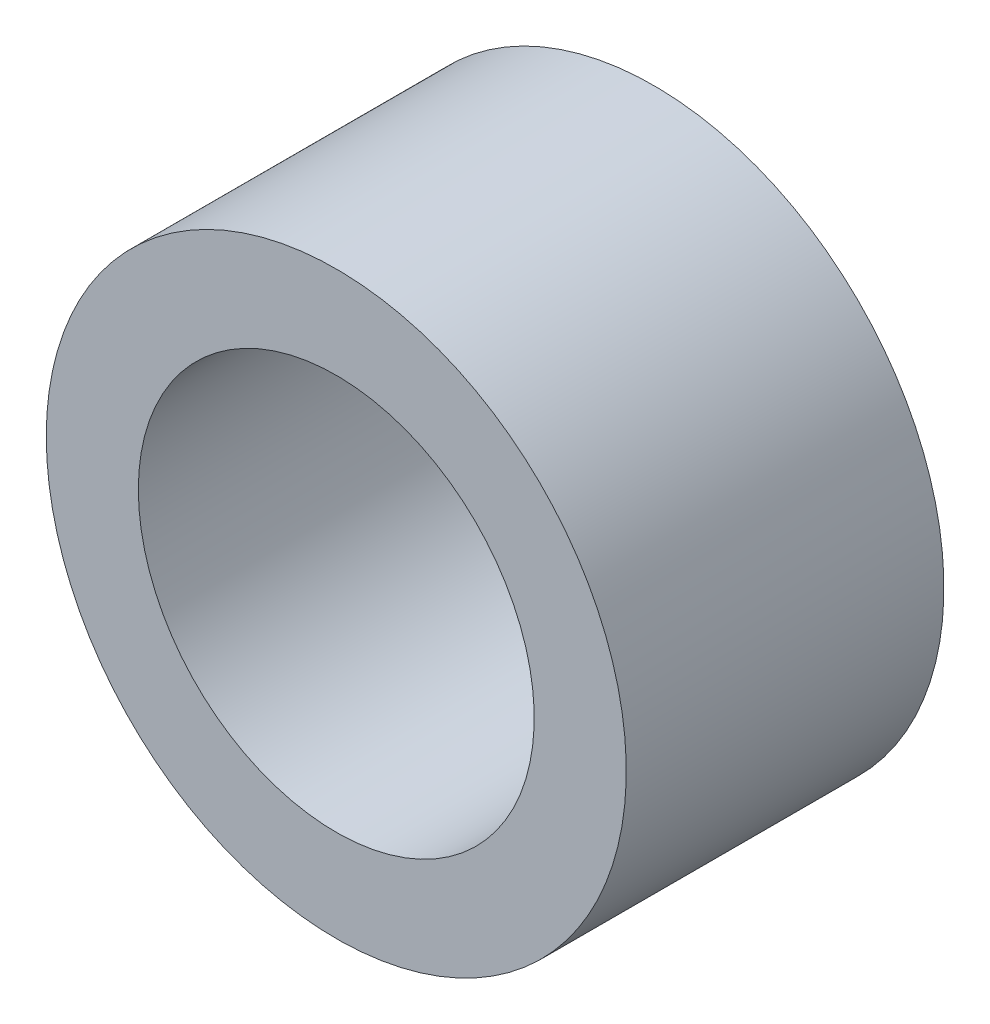
ISO-10303-21;
HEADER;
FILE_DESCRIPTION(('STEP AP214'),'2;1');
FILE_NAME('part.step','',(''),(''),'','','');
FILE_SCHEMA(('AUTOMOTIVE_DESIGN { 1 0 10303 214 1 1 1 1 }'));
ENDSEC;
DATA;
#1=APPLICATION_CONTEXT('core data for automotive mechanical design processes');
#2=APPLICATION_PROTOCOL_DEFINITION('international standard','automotive_design',2000,#1);
#3=PRODUCT_CONTEXT('',#1,'mechanical');
#4=PRODUCT('Part','Part','',(#3));
#5=PRODUCT_RELATED_PRODUCT_CATEGORY('part','',(#4));
#6=PRODUCT_DEFINITION_FORMATION('','',#4);
#7=PRODUCT_DEFINITION_CONTEXT('part definition',#1,'design');
#8=PRODUCT_DEFINITION('design','',#6,#7);
#9=PRODUCT_DEFINITION_SHAPE('','',#8);
#10=(LENGTH_UNIT() NAMED_UNIT(*) SI_UNIT(.MILLI.,.METRE.));
#11=(NAMED_UNIT(*) PLANE_ANGLE_UNIT() SI_UNIT($,.RADIAN.));
#12=(NAMED_UNIT(*) SI_UNIT($,.STERADIAN.) SOLID_ANGLE_UNIT());
#13=UNCERTAINTY_MEASURE_WITH_UNIT(LENGTH_MEASURE(1.E-05),#10,'distance_accuracy_value','');
#14=(GEOMETRIC_REPRESENTATION_CONTEXT(3) GLOBAL_UNCERTAINTY_ASSIGNED_CONTEXT((#13)) GLOBAL_UNIT_ASSIGNED_CONTEXT((#10,
#11,#12)) REPRESENTATION_CONTEXT('',''));
#15=CARTESIAN_POINT('',(0.,0.,0.));
#16=DIRECTION('',(0.,0.,1.));
#17=DIRECTION('',(1.,0.,0.));
#18=AXIS2_PLACEMENT_3D('',#15,#16,#17);
#19=CARTESIAN_POINT('',(0.,0.,3.45));
#20=DIRECTION('',(0.,0.,1.));
#21=DIRECTION('',(1.,0.,0.));
#22=AXIS2_PLACEMENT_3D('',#19,#20,#21);
#23=PLANE('',#22);
#24=CARTESIAN_POINT('',(0.,0.,3.45));
#25=DIRECTION('',(0.,0.,1.));
#26=DIRECTION('',(1.,0.,0.));
#27=AXIS2_PLACEMENT_3D('',#24,#25,#26);
#28=CIRCLE('',#27,3.15);
#29=CARTESIAN_POINT('',(-3.15,0.,3.45));
#30=VERTEX_POINT('',#29);
#31=EDGE_CURVE('E10',#30,#30,#28,.T.);
#32=ORIENTED_EDGE('',*,*,#31,.T.);
#33=EDGE_LOOP('',(#32));
#34=FACE_BOUND('',#33,.T.);
#35=CARTESIAN_POINT('',(0.,0.,3.45));
#36=DIRECTION('',(0.,0.,1.));
#37=DIRECTION('',(1.,0.,0.));
#38=AXIS2_PLACEMENT_3D('',#35,#36,#37);
#39=CIRCLE('',#38,2.15);
#40=CARTESIAN_POINT('',(-2.15,0.,3.45));
#41=VERTEX_POINT('',#40);
#42=EDGE_CURVE('E56',#41,#41,#39,.T.);
#43=ORIENTED_EDGE('',*,*,#42,.F.);
#44=EDGE_LOOP('',(#43));
#45=FACE_BOUND('',#44,.T.);
#46=ADVANCED_FACE('F43',(#34,#45),#23,.T.);
#47=CARTESIAN_POINT('',(0.,0.,0.));
#48=DIRECTION('',(0.,0.,1.));
#49=DIRECTION('',(1.,0.,0.));
#50=AXIS2_PLACEMENT_3D('',#47,#48,#49);
#51=PLANE('',#50);
#52=CARTESIAN_POINT('',(0.,0.,0.));
#53=DIRECTION('',(0.,0.,1.));
#54=DIRECTION('',(1.,0.,0.));
#55=AXIS2_PLACEMENT_3D('',#52,#53,#54);
#56=CIRCLE('',#55,3.15);
#57=CARTESIAN_POINT('',(-3.15,0.,0.));
#58=VERTEX_POINT('',#57);
#59=EDGE_CURVE('E47',#58,#58,#56,.T.);
#60=ORIENTED_EDGE('',*,*,#59,.F.);
#61=EDGE_LOOP('',(#60));
#62=FACE_BOUND('',#61,.T.);
#63=CARTESIAN_POINT('',(0.,0.,0.));
#64=DIRECTION('',(0.,0.,1.));
#65=DIRECTION('',(1.,0.,0.));
#66=AXIS2_PLACEMENT_3D('',#63,#64,#65);
#67=CIRCLE('',#66,2.15);
#68=CARTESIAN_POINT('',(-2.15,0.,0.));
#69=VERTEX_POINT('',#68);
#70=EDGE_CURVE('E58',#69,#69,#67,.T.);
#71=ORIENTED_EDGE('',*,*,#70,.T.);
#72=EDGE_LOOP('',(#71));
#73=FACE_BOUND('',#72,.T.);
#74=ADVANCED_FACE('F70',(#62,#73),#51,.F.);
#75=CARTESIAN_POINT('',(0.,0.,3.45));
#76=DIRECTION('',(0.,0.,-1.));
#77=DIRECTION('',(-1.,0.,0.));
#78=AXIS2_PLACEMENT_3D('',#75,#76,#77);
#79=CYLINDRICAL_SURFACE('',#78,3.15);
#80=CARTESIAN_POINT('',(-3.15,0.,3.45));
#81=CARTESIAN_POINT('',(-3.15,0.,3.4140625));
#82=CARTESIAN_POINT('',(-3.15,0.,3.378125));
#83=CARTESIAN_POINT('',(-3.15,0.,3.30625));
#84=CARTESIAN_POINT('',(-3.15,0.,3.2703125));
#85=CARTESIAN_POINT('',(-3.15,0.,3.1984375));
#86=CARTESIAN_POINT('',(-3.15,0.,3.1625));
#87=CARTESIAN_POINT('',(-3.15,0.,3.090625));
#88=CARTESIAN_POINT('',(-3.15,0.,3.0546875));
#89=CARTESIAN_POINT('',(-3.15,0.,2.9828125));
#90=CARTESIAN_POINT('',(-3.15,0.,2.946875));
#91=CARTESIAN_POINT('',(-3.15,0.,2.875));
#92=CARTESIAN_POINT('',(-3.15,0.,2.8390625));
#93=CARTESIAN_POINT('',(-3.15,0.,2.7671875));
#94=CARTESIAN_POINT('',(-3.15,0.,2.73125));
#95=CARTESIAN_POINT('',(-3.15,0.,2.659375));
#96=CARTESIAN_POINT('',(-3.15,0.,2.6234375));
#97=CARTESIAN_POINT('',(-3.15,0.,2.5515625));
#98=CARTESIAN_POINT('',(-3.15,0.,2.515625));
#99=CARTESIAN_POINT('',(-3.15,0.,2.44375));
#100=CARTESIAN_POINT('',(-3.15,0.,2.4078125));
#101=CARTESIAN_POINT('',(-3.15,0.,2.3359375));
#102=CARTESIAN_POINT('',(-3.15,0.,2.3));
#103=CARTESIAN_POINT('',(-3.15,0.,2.228125));
#104=CARTESIAN_POINT('',(-3.15,0.,2.1921875));
#105=CARTESIAN_POINT('',(-3.15,0.,2.1203125));
#106=CARTESIAN_POINT('',(-3.15,0.,2.084375));
#107=CARTESIAN_POINT('',(-3.15,0.,2.0125));
#108=CARTESIAN_POINT('',(-3.15,0.,1.9765625));
#109=CARTESIAN_POINT('',(-3.15,0.,1.9046875));
#110=CARTESIAN_POINT('',(-3.15,0.,1.86875));
#111=CARTESIAN_POINT('',(-3.15,0.,1.796875));
#112=CARTESIAN_POINT('',(-3.15,0.,1.7609375));
#113=CARTESIAN_POINT('',(-3.15,0.,1.6890625));
#114=CARTESIAN_POINT('',(-3.15,0.,1.653125));
#115=CARTESIAN_POINT('',(-3.15,0.,1.58125));
#116=CARTESIAN_POINT('',(-3.15,0.,1.5453125));
#117=CARTESIAN_POINT('',(-3.15,0.,1.4734375));
#118=CARTESIAN_POINT('',(-3.15,0.,1.4375));
#119=CARTESIAN_POINT('',(-3.15,0.,1.365625));
#120=CARTESIAN_POINT('',(-3.15,0.,1.3296875));
#121=CARTESIAN_POINT('',(-3.15,0.,1.2578125));
#122=CARTESIAN_POINT('',(-3.15,0.,1.221875));
#123=CARTESIAN_POINT('',(-3.15,0.,1.15));
#124=CARTESIAN_POINT('',(-3.15,0.,1.1140625));
#125=CARTESIAN_POINT('',(-3.15,0.,1.0421875));
#126=CARTESIAN_POINT('',(-3.15,0.,1.00625));
#127=CARTESIAN_POINT('',(-3.15,0.,0.934375));
#128=CARTESIAN_POINT('',(-3.15,0.,0.8984375));
#129=CARTESIAN_POINT('',(-3.15,0.,0.8265625));
#130=CARTESIAN_POINT('',(-3.15,0.,0.790625));
#131=CARTESIAN_POINT('',(-3.15,0.,0.71875));
#132=CARTESIAN_POINT('',(-3.15,0.,0.6828125));
#133=CARTESIAN_POINT('',(-3.15,0.,0.6109375));
#134=CARTESIAN_POINT('',(-3.15,0.,0.575));
#135=CARTESIAN_POINT('',(-3.15,0.,0.503125));
#136=CARTESIAN_POINT('',(-3.15,0.,0.4671875));
#137=CARTESIAN_POINT('',(-3.15,0.,0.3953125));
#138=CARTESIAN_POINT('',(-3.15,0.,0.359375));
#139=CARTESIAN_POINT('',(-3.15,0.,0.2875));
#140=CARTESIAN_POINT('',(-3.15,0.,0.2515625));
#141=CARTESIAN_POINT('',(-3.15,0.,0.1796875));
#142=CARTESIAN_POINT('',(-3.15,0.,0.14375));
#143=CARTESIAN_POINT('',(-3.15,0.,0.0718749999999999));
#144=CARTESIAN_POINT('',(-3.15,0.,0.0359374999999999));
#145=CARTESIAN_POINT('',(-3.15,0.,0.));
#146=B_SPLINE_CURVE_WITH_KNOTS('',3,(#80,#81,#82,#83,#84,#85,#86,#87,#88,#89,#90,#91,#92,#93,
#94,#95,#96,#97,#98,#99,#100,#101,#102,#103,#104,#105,#106,#107,#108,#109,#110,#111,#112,#113,
#114,#115,#116,#117,#118,#119,#120,#121,#122,#123,#124,#125,#126,#127,#128,#129,#130,#131,#132,
#133,#134,#135,#136,#137,#138,#139,#140,#141,#142,#143,#144,#145),.UNSPECIFIED.,.F.,.F.,(4,2,2,
2,2,2,2,2,2,2,2,2,2,2,2,2,2,2,2,2,2,2,2,2,2,2,2,2,2,2,2,2,4),(0.,0.1078125,0.215625,0.3234375,
0.43125,0.5390625,0.646875,0.7546875,0.8625,0.9703125,1.078125,1.1859375,1.29375,1.4015625,
1.509375,1.6171875,1.725,1.8328125,1.940625,2.0484375,2.15625,2.2640625,2.371875,2.4796875,
2.5875,2.6953125,2.803125,2.9109375,3.01875,3.1265625,3.234375,3.3421875,3.45),.UNSPECIFIED.);
#147=EDGE_CURVE('BSEAM45',#30,#58,#146,.T.);
#148=ORIENTED_EDGE('',*,*,#31,.F.);
#149=ORIENTED_EDGE('',*,*,#59,.T.);
#150=ORIENTED_EDGE('',*,*,#147,.T.);
#151=ORIENTED_EDGE('',*,*,#147,.F.);
#152=EDGE_LOOP('',(#148,#150,#149,#151));
#153=FACE_BOUND('',#152,.T.);
#154=ADVANCED_FACE('F45',(#153),#79,.T.);
#155=CARTESIAN_POINT('',(0.,0.,3.45));
#156=DIRECTION('',(0.,0.,-1.));
#157=DIRECTION('',(-1.,0.,0.));
#158=AXIS2_PLACEMENT_3D('',#155,#156,#157);
#159=CYLINDRICAL_SURFACE('',#158,2.15);
#160=CARTESIAN_POINT('',(-2.15,0.,3.45));
#161=CARTESIAN_POINT('',(-2.15,0.,3.4140625));
#162=CARTESIAN_POINT('',(-2.15,0.,3.378125));
#163=CARTESIAN_POINT('',(-2.15,0.,3.30625));
#164=CARTESIAN_POINT('',(-2.15,0.,3.2703125));
#165=CARTESIAN_POINT('',(-2.15,0.,3.1984375));
#166=CARTESIAN_POINT('',(-2.15,0.,3.1625));
#167=CARTESIAN_POINT('',(-2.15,0.,3.090625));
#168=CARTESIAN_POINT('',(-2.15,0.,3.0546875));
#169=CARTESIAN_POINT('',(-2.15,0.,2.9828125));
#170=CARTESIAN_POINT('',(-2.15,0.,2.946875));
#171=CARTESIAN_POINT('',(-2.15,0.,2.875));
#172=CARTESIAN_POINT('',(-2.15,0.,2.8390625));
#173=CARTESIAN_POINT('',(-2.15,0.,2.7671875));
#174=CARTESIAN_POINT('',(-2.15,0.,2.73125));
#175=CARTESIAN_POINT('',(-2.15,0.,2.659375));
#176=CARTESIAN_POINT('',(-2.15,0.,2.6234375));
#177=CARTESIAN_POINT('',(-2.15,0.,2.5515625));
#178=CARTESIAN_POINT('',(-2.15,0.,2.515625));
#179=CARTESIAN_POINT('',(-2.15,0.,2.44375));
#180=CARTESIAN_POINT('',(-2.15,0.,2.4078125));
#181=CARTESIAN_POINT('',(-2.15,0.,2.3359375));
#182=CARTESIAN_POINT('',(-2.15,0.,2.3));
#183=CARTESIAN_POINT('',(-2.15,0.,2.228125));
#184=CARTESIAN_POINT('',(-2.15,0.,2.1921875));
#185=CARTESIAN_POINT('',(-2.15,0.,2.1203125));
#186=CARTESIAN_POINT('',(-2.15,0.,2.084375));
#187=CARTESIAN_POINT('',(-2.15,0.,2.0125));
#188=CARTESIAN_POINT('',(-2.15,0.,1.9765625));
#189=CARTESIAN_POINT('',(-2.15,0.,1.9046875));
#190=CARTESIAN_POINT('',(-2.15,0.,1.86875));
#191=CARTESIAN_POINT('',(-2.15,0.,1.796875));
#192=CARTESIAN_POINT('',(-2.15,0.,1.7609375));
#193=CARTESIAN_POINT('',(-2.15,0.,1.6890625));
#194=CARTESIAN_POINT('',(-2.15,0.,1.653125));
#195=CARTESIAN_POINT('',(-2.15,0.,1.58125));
#196=CARTESIAN_POINT('',(-2.15,0.,1.5453125));
#197=CARTESIAN_POINT('',(-2.15,0.,1.4734375));
#198=CARTESIAN_POINT('',(-2.15,0.,1.4375));
#199=CARTESIAN_POINT('',(-2.15,0.,1.365625));
#200=CARTESIAN_POINT('',(-2.15,0.,1.3296875));
#201=CARTESIAN_POINT('',(-2.15,0.,1.2578125));
#202=CARTESIAN_POINT('',(-2.15,0.,1.221875));
#203=CARTESIAN_POINT('',(-2.15,0.,1.15));
#204=CARTESIAN_POINT('',(-2.15,0.,1.1140625));
#205=CARTESIAN_POINT('',(-2.15,0.,1.0421875));
#206=CARTESIAN_POINT('',(-2.15,0.,1.00625));
#207=CARTESIAN_POINT('',(-2.15,0.,0.934375));
#208=CARTESIAN_POINT('',(-2.15,0.,0.8984375));
#209=CARTESIAN_POINT('',(-2.15,0.,0.8265625));
#210=CARTESIAN_POINT('',(-2.15,0.,0.790625));
#211=CARTESIAN_POINT('',(-2.15,0.,0.71875));
#212=CARTESIAN_POINT('',(-2.15,0.,0.6828125));
#213=CARTESIAN_POINT('',(-2.15,0.,0.6109375));
#214=CARTESIAN_POINT('',(-2.15,0.,0.575));
#215=CARTESIAN_POINT('',(-2.15,0.,0.503125));
#216=CARTESIAN_POINT('',(-2.15,0.,0.4671875));
#217=CARTESIAN_POINT('',(-2.15,0.,0.3953125));
#218=CARTESIAN_POINT('',(-2.15,0.,0.359375));
#219=CARTESIAN_POINT('',(-2.15,0.,0.2875));
#220=CARTESIAN_POINT('',(-2.15,0.,0.2515625));
#221=CARTESIAN_POINT('',(-2.15,0.,0.1796875));
#222=CARTESIAN_POINT('',(-2.15,0.,0.14375));
#223=CARTESIAN_POINT('',(-2.15,0.,0.0718749999999999));
#224=CARTESIAN_POINT('',(-2.15,0.,0.0359374999999999));
#225=CARTESIAN_POINT('',(-2.15,0.,0.));
#226=B_SPLINE_CURVE_WITH_KNOTS('',3,(#160,#161,#162,#163,#164,#165,#166,#167,#168,#169,#170,
#171,#172,#173,#174,#175,#176,#177,#178,#179,#180,#181,#182,#183,#184,#185,#186,#187,#188,#189,
#190,#191,#192,#193,#194,#195,#196,#197,#198,#199,#200,#201,#202,#203,#204,#205,#206,#207,#208,
#209,#210,#211,#212,#213,#214,#215,#216,#217,#218,#219,#220,#221,#222,#223,#224,#225),
.UNSPECIFIED.,.F.,.F.,(4,2,2,2,2,2,2,2,2,2,2,2,2,2,2,2,2,2,2,2,2,2,2,2,2,2,2,2,2,2,2,2,4),(0.,
0.1078125,0.215625,0.3234375,0.43125,0.5390625,0.646875,0.7546875,0.8625,0.9703125,1.078125,
1.1859375,1.29375,1.4015625,1.509375,1.6171875,1.725,1.8328125,1.940625,2.0484375,2.15625,
2.2640625,2.371875,2.4796875,2.5875,2.6953125,2.803125,2.9109375,3.01875,3.1265625,3.234375,
3.3421875,3.45),.UNSPECIFIED.);
#227=EDGE_CURVE('BSEAM66',#41,#69,#226,.T.);
#228=ORIENTED_EDGE('',*,*,#42,.T.);
#229=ORIENTED_EDGE('',*,*,#70,.F.);
#230=ORIENTED_EDGE('',*,*,#227,.T.);
#231=ORIENTED_EDGE('',*,*,#227,.F.);
#232=EDGE_LOOP('',(#228,#230,#229,#231));
#233=FACE_BOUND('',#232,.T.);
#234=ADVANCED_FACE('F66',(#233),#159,.F.);
#235=CLOSED_SHELL('',(#46,#74,#154,#234));
#236=MANIFOLD_SOLID_BREP('B2',#235);
#237=ADVANCED_BREP_SHAPE_REPRESENTATION('',(#18,#236),#14);
#238=SHAPE_DEFINITION_REPRESENTATION(#9,#237);
ENDSEC;
END-ISO-10303-21;
